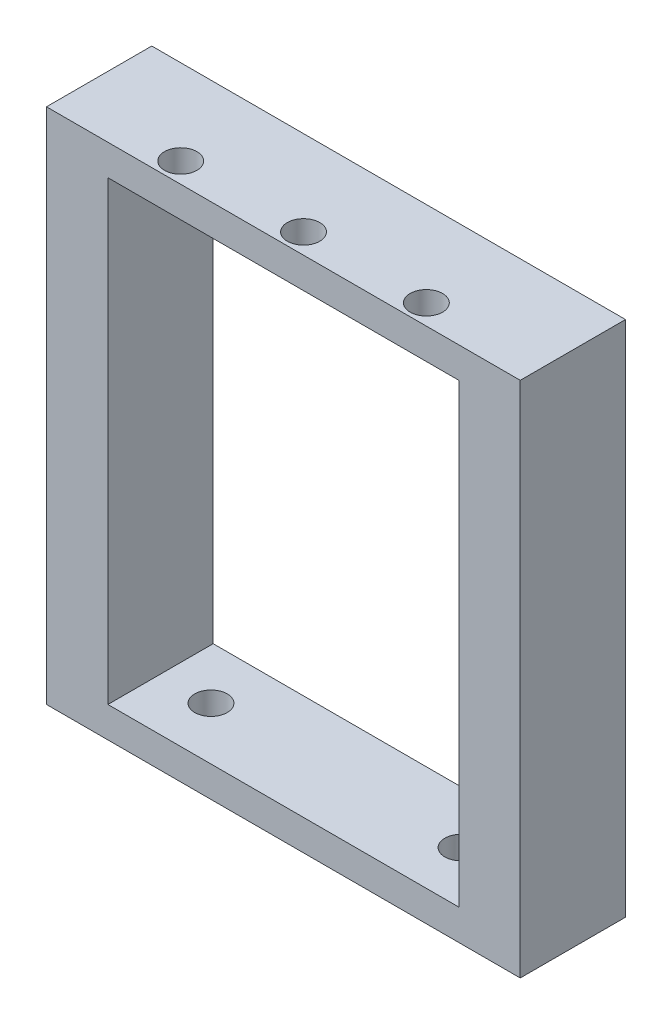
ISO-10303-21;
HEADER;
FILE_DESCRIPTION(('STEP AP214'),'2;1');
FILE_NAME('part.step','',(''),(''),'','','');
FILE_SCHEMA(('AUTOMOTIVE_DESIGN { 1 0 10303 214 1 1 1 1 }'));
ENDSEC;
DATA;
#1=APPLICATION_CONTEXT('core data for automotive mechanical design processes');
#2=APPLICATION_PROTOCOL_DEFINITION('international standard','automotive_design',2000,#1);
#3=PRODUCT_CONTEXT('',#1,'mechanical');
#4=PRODUCT('Part','Part','',(#3));
#5=PRODUCT_RELATED_PRODUCT_CATEGORY('part','',(#4));
#6=PRODUCT_DEFINITION_FORMATION('','',#4);
#7=PRODUCT_DEFINITION_CONTEXT('part definition',#1,'design');
#8=PRODUCT_DEFINITION('design','',#6,#7);
#9=PRODUCT_DEFINITION_SHAPE('','',#8);
#10=(LENGTH_UNIT() NAMED_UNIT(*) SI_UNIT(.MILLI.,.METRE.));
#11=(NAMED_UNIT(*) PLANE_ANGLE_UNIT() SI_UNIT($,.RADIAN.));
#12=(NAMED_UNIT(*) SI_UNIT($,.STERADIAN.) SOLID_ANGLE_UNIT());
#13=UNCERTAINTY_MEASURE_WITH_UNIT(LENGTH_MEASURE(1.E-05),#10,'distance_accuracy_value','');
#14=(GEOMETRIC_REPRESENTATION_CONTEXT(3) GLOBAL_UNCERTAINTY_ASSIGNED_CONTEXT((#13)) GLOBAL_UNIT_ASSIGNED_CONTEXT((#10,
#11,#12)) REPRESENTATION_CONTEXT('',''));
#15=CARTESIAN_POINT('',(0.,0.,0.));
#16=DIRECTION('',(0.,0.,1.));
#17=DIRECTION('',(1.,0.,0.));
#18=AXIS2_PLACEMENT_3D('',#15,#16,#17);
#19=CARTESIAN_POINT('',(0.,0.,12.));
#20=DIRECTION('',(0.,0.,-1.));
#21=DIRECTION('',(-1.,0.,0.));
#22=AXIS2_PLACEMENT_3D('',#19,#20,#21);
#23=PLANE('',#22);
#24=DIRECTION('',(0.,-1.,0.));
#25=VECTOR('',#24,1.);
#26=CARTESIAN_POINT('',(0.,0.,12.));
#27=LINE('',#26,#25);
#28=CARTESIAN_POINT('',(0.,59.,12.));
#29=VERTEX_POINT('',#28);
#30=CARTESIAN_POINT('',(0.,0.,12.));
#31=VERTEX_POINT('',#30);
#32=EDGE_CURVE('E157',#29,#31,#27,.T.);
#33=ORIENTED_EDGE('',*,*,#32,.T.);
#34=DIRECTION('',(1.,0.,0.));
#35=VECTOR('',#34,1.);
#36=CARTESIAN_POINT('',(0.,0.,12.));
#37=LINE('',#36,#35);
#38=CARTESIAN_POINT('',(54.,0.,12.));
#39=VERTEX_POINT('',#38);
#40=EDGE_CURVE('E161',#31,#39,#37,.T.);
#41=ORIENTED_EDGE('',*,*,#40,.T.);
#42=DIRECTION('',(0.,1.,0.));
#43=VECTOR('',#42,1.);
#44=CARTESIAN_POINT('',(54.,0.,12.));
#45=LINE('',#44,#43);
#46=CARTESIAN_POINT('',(54.,59.,12.));
#47=VERTEX_POINT('',#46);
#48=EDGE_CURVE('E165',#39,#47,#45,.T.);
#49=ORIENTED_EDGE('',*,*,#48,.T.);
#50=DIRECTION('',(-1.,0.,0.));
#51=VECTOR('',#50,1.);
#52=CARTESIAN_POINT('',(0.,59.,12.));
#53=LINE('',#52,#51);
#54=EDGE_CURVE('E168',#47,#29,#53,.T.);
#55=ORIENTED_EDGE('',*,*,#54,.T.);
#56=EDGE_LOOP('',(#33,#41,#49,#55));
#57=FACE_BOUND('',#56,.T.);
#58=DIRECTION('',(0.,1.,0.));
#59=VECTOR('',#58,1.);
#60=CARTESIAN_POINT('',(47.,3.50000000000001,12.));
#61=LINE('',#60,#59);
#62=CARTESIAN_POINT('',(47.,3.50000000000001,12.));
#63=VERTEX_POINT('',#62);
#64=CARTESIAN_POINT('',(47.,55.5,12.));
#65=VERTEX_POINT('',#64);
#66=EDGE_CURVE('E107',#63,#65,#61,.T.);
#67=ORIENTED_EDGE('',*,*,#66,.F.);
#68=DIRECTION('',(1.,0.,0.));
#69=VECTOR('',#68,1.);
#70=CARTESIAN_POINT('',(7.,3.50000000000001,12.));
#71=LINE('',#70,#69);
#72=CARTESIAN_POINT('',(7.,3.50000000000001,12.));
#73=VERTEX_POINT('',#72);
#74=EDGE_CURVE('E133',#73,#63,#71,.T.);
#75=ORIENTED_EDGE('',*,*,#74,.F.);
#76=DIRECTION('',(0.,-1.,0.));
#77=VECTOR('',#76,1.);
#78=CARTESIAN_POINT('',(7.,3.50000000000001,12.));
#79=LINE('',#78,#77);
#80=CARTESIAN_POINT('',(7.,55.5,12.));
#81=VERTEX_POINT('',#80);
#82=EDGE_CURVE('E129',#81,#73,#79,.T.);
#83=ORIENTED_EDGE('',*,*,#82,.F.);
#84=DIRECTION('',(-1.,0.,0.));
#85=VECTOR('',#84,1.);
#86=CARTESIAN_POINT('',(7.,55.5,12.));
#87=LINE('',#86,#85);
#88=EDGE_CURVE('E116',#65,#81,#87,.T.);
#89=ORIENTED_EDGE('',*,*,#88,.F.);
#90=EDGE_LOOP('',(#67,#75,#83,#89));
#91=FACE_BOUND('',#90,.T.);
#92=ADVANCED_FACE('F39',(#57,#91),#23,.F.);
#93=CARTESIAN_POINT('',(0.,0.,0.));
#94=DIRECTION('',(0.,0.,-1.));
#95=DIRECTION('',(-1.,0.,0.));
#96=AXIS2_PLACEMENT_3D('',#93,#94,#95);
#97=PLANE('',#96);
#98=DIRECTION('',(0.,-1.,0.));
#99=VECTOR('',#98,1.);
#100=CARTESIAN_POINT('',(0.,0.,0.));
#101=LINE('',#100,#99);
#102=CARTESIAN_POINT('',(0.,59.,0.));
#103=VERTEX_POINT('',#102);
#104=CARTESIAN_POINT('',(0.,0.,0.));
#105=VERTEX_POINT('',#104);
#106=EDGE_CURVE('E125',#103,#105,#101,.T.);
#107=ORIENTED_EDGE('',*,*,#106,.F.);
#108=DIRECTION('',(-1.,0.,0.));
#109=VECTOR('',#108,1.);
#110=CARTESIAN_POINT('',(0.,59.,0.));
#111=LINE('',#110,#109);
#112=CARTESIAN_POINT('',(54.,59.,0.));
#113=VERTEX_POINT('',#112);
#114=EDGE_CURVE('E162',#113,#103,#111,.T.);
#115=ORIENTED_EDGE('',*,*,#114,.F.);
#116=DIRECTION('',(0.,1.,0.));
#117=VECTOR('',#116,1.);
#118=CARTESIAN_POINT('',(54.,0.,0.));
#119=LINE('',#118,#117);
#120=CARTESIAN_POINT('',(54.,0.,0.));
#121=VERTEX_POINT('',#120);
#122=EDGE_CURVE('E178',#121,#113,#119,.T.);
#123=ORIENTED_EDGE('',*,*,#122,.F.);
#124=DIRECTION('',(1.,0.,0.));
#125=VECTOR('',#124,1.);
#126=CARTESIAN_POINT('',(0.,0.,0.));
#127=LINE('',#126,#125);
#128=EDGE_CURVE('E175',#105,#121,#127,.T.);
#129=ORIENTED_EDGE('',*,*,#128,.F.);
#130=EDGE_LOOP('',(#107,#115,#123,#129));
#131=FACE_BOUND('',#130,.T.);
#132=DIRECTION('',(1.,0.,0.));
#133=VECTOR('',#132,1.);
#134=CARTESIAN_POINT('',(7.,3.50000000000001,0.));
#135=LINE('',#134,#133);
#136=CARTESIAN_POINT('',(7.,3.50000000000001,0.));
#137=VERTEX_POINT('',#136);
#138=CARTESIAN_POINT('',(47.,3.50000000000001,0.));
#139=VERTEX_POINT('',#138);
#140=EDGE_CURVE('E117',#137,#139,#135,.T.);
#141=ORIENTED_EDGE('',*,*,#140,.T.);
#142=DIRECTION('',(0.,1.,0.));
#143=VECTOR('',#142,1.);
#144=CARTESIAN_POINT('',(47.,3.50000000000001,0.));
#145=LINE('',#144,#143);
#146=CARTESIAN_POINT('',(47.,55.5,0.));
#147=VERTEX_POINT('',#146);
#148=EDGE_CURVE('E65',#139,#147,#145,.T.);
#149=ORIENTED_EDGE('',*,*,#148,.T.);
#150=DIRECTION('',(-1.,0.,0.));
#151=VECTOR('',#150,1.);
#152=CARTESIAN_POINT('',(7.,55.5,0.));
#153=LINE('',#152,#151);
#154=CARTESIAN_POINT('',(7.,55.5,0.));
#155=VERTEX_POINT('',#154);
#156=EDGE_CURVE('E123',#147,#155,#153,.T.);
#157=ORIENTED_EDGE('',*,*,#156,.T.);
#158=DIRECTION('',(0.,-1.,0.));
#159=VECTOR('',#158,1.);
#160=CARTESIAN_POINT('',(7.,3.50000000000001,0.));
#161=LINE('',#160,#159);
#162=EDGE_CURVE('E144',#155,#137,#161,.T.);
#163=ORIENTED_EDGE('',*,*,#162,.T.);
#164=EDGE_LOOP('',(#141,#149,#157,#163));
#165=FACE_BOUND('',#164,.T.);
#166=ADVANCED_FACE('F251',(#131,#165),#97,.T.);
#167=CARTESIAN_POINT('',(0.,0.,12.));
#168=DIRECTION('',(1.,0.,0.));
#169=DIRECTION('',(0.,0.,-1.));
#170=AXIS2_PLACEMENT_3D('',#167,#168,#169);
#171=PLANE('',#170);
#172=ORIENTED_EDGE('',*,*,#106,.T.);
#173=DIRECTION('',(0.,0.,-1.));
#174=VECTOR('',#173,1.);
#175=CARTESIAN_POINT('',(0.,0.,12.));
#176=LINE('',#175,#174);
#177=EDGE_CURVE('E11',#31,#105,#176,.T.);
#178=ORIENTED_EDGE('',*,*,#177,.F.);
#179=ORIENTED_EDGE('',*,*,#32,.F.);
#180=DIRECTION('',(0.,0.,-1.));
#181=VECTOR('',#180,1.);
#182=CARTESIAN_POINT('',(0.,59.,12.));
#183=LINE('',#182,#181);
#184=EDGE_CURVE('E171',#29,#103,#183,.T.);
#185=ORIENTED_EDGE('',*,*,#184,.T.);
#186=EDGE_LOOP('',(#172,#178,#179,#185));
#187=FACE_BOUND('',#186,.T.);
#188=ADVANCED_FACE('F41',(#187),#171,.F.);
#189=CARTESIAN_POINT('',(0.,0.,12.));
#190=DIRECTION('',(0.,1.,0.));
#191=DIRECTION('',(0.,0.,1.));
#192=AXIS2_PLACEMENT_3D('',#189,#190,#191);
#193=PLANE('',#192);
#194=CARTESIAN_POINT('',(12.75,0.,6.));
#195=DIRECTION('',(0.,-1.,0.));
#196=DIRECTION('',(0.,0.,-1.));
#197=AXIS2_PLACEMENT_3D('',#194,#195,#196);
#198=CIRCLE('',#197,1.85);
#199=CARTESIAN_POINT('',(12.75,0.,4.15));
#200=VERTEX_POINT('',#199);
#201=EDGE_CURVE('E207',#200,#200,#198,.T.);
#202=ORIENTED_EDGE('',*,*,#201,.F.);
#203=EDGE_LOOP('',(#202));
#204=FACE_BOUND('',#203,.T.);
#205=CARTESIAN_POINT('',(41.25,0.,6.));
#206=DIRECTION('',(0.,-1.,0.));
#207=DIRECTION('',(0.,0.,1.));
#208=AXIS2_PLACEMENT_3D('',#205,#206,#207);
#209=CIRCLE('',#208,1.85);
#210=CARTESIAN_POINT('',(41.25,0.,7.85));
#211=VERTEX_POINT('',#210);
#212=EDGE_CURVE('E215',#211,#211,#209,.T.);
#213=ORIENTED_EDGE('',*,*,#212,.F.);
#214=EDGE_LOOP('',(#213));
#215=FACE_BOUND('',#214,.T.);
#216=ORIENTED_EDGE('',*,*,#128,.T.);
#217=DIRECTION('',(0.,0.,-1.));
#218=VECTOR('',#217,1.);
#219=CARTESIAN_POINT('',(54.,0.,12.));
#220=LINE('',#219,#218);
#221=EDGE_CURVE('E49',#39,#121,#220,.T.);
#222=ORIENTED_EDGE('',*,*,#221,.F.);
#223=ORIENTED_EDGE('',*,*,#40,.F.);
#224=ORIENTED_EDGE('',*,*,#177,.T.);
#225=EDGE_LOOP('',(#216,#222,#223,#224));
#226=FACE_BOUND('',#225,.T.);
#227=ADVANCED_FACE('F255',(#204,#215,#226),#193,.F.);
#228=CARTESIAN_POINT('',(54.,0.,12.));
#229=DIRECTION('',(-1.,0.,0.));
#230=DIRECTION('',(0.,0.,1.));
#231=AXIS2_PLACEMENT_3D('',#228,#229,#230);
#232=PLANE('',#231);
#233=ORIENTED_EDGE('',*,*,#122,.T.);
#234=DIRECTION('',(0.,0.,-1.));
#235=VECTOR('',#234,1.);
#236=CARTESIAN_POINT('',(54.,59.,12.));
#237=LINE('',#236,#235);
#238=EDGE_CURVE('E186',#47,#113,#237,.T.);
#239=ORIENTED_EDGE('',*,*,#238,.F.);
#240=ORIENTED_EDGE('',*,*,#48,.F.);
#241=ORIENTED_EDGE('',*,*,#221,.T.);
#242=EDGE_LOOP('',(#233,#239,#240,#241));
#243=FACE_BOUND('',#242,.T.);
#244=ADVANCED_FACE('F238',(#243),#232,.F.);
#245=CARTESIAN_POINT('',(0.,59.,12.));
#246=DIRECTION('',(0.,-1.,0.));
#247=DIRECTION('',(0.,0.,-1.));
#248=AXIS2_PLACEMENT_3D('',#245,#246,#247);
#249=PLANE('',#248);
#250=CARTESIAN_POINT('',(13.,59.,9.69999999999999));
#251=DIRECTION('',(0.,1.,0.));
#252=DIRECTION('',(-1.,0.,0.));
#253=AXIS2_PLACEMENT_3D('',#250,#251,#252);
#254=CIRCLE('',#253,1.85);
#255=CARTESIAN_POINT('',(11.15,59.,9.69999999999999));
#256=VERTEX_POINT('',#255);
#257=EDGE_CURVE('E198',#256,#256,#254,.T.);
#258=ORIENTED_EDGE('',*,*,#257,.F.);
#259=EDGE_LOOP('',(#258));
#260=FACE_BOUND('',#259,.T.);
#261=CARTESIAN_POINT('',(41.,59.0000000000002,9.69999999999999));
#262=DIRECTION('',(0.,1.,0.));
#263=DIRECTION('',(-1.,0.,0.));
#264=AXIS2_PLACEMENT_3D('',#261,#262,#263);
#265=CIRCLE('',#264,1.85);
#266=CARTESIAN_POINT('',(39.15,59.0000000000001,9.69999999999999));
#267=VERTEX_POINT('',#266);
#268=EDGE_CURVE('E226',#267,#267,#265,.T.);
#269=ORIENTED_EDGE('',*,*,#268,.F.);
#270=EDGE_LOOP('',(#269));
#271=FACE_BOUND('',#270,.T.);
#272=CARTESIAN_POINT('',(27.,59.0000000000001,9.69999999999999));
#273=DIRECTION('',(0.,1.,0.));
#274=DIRECTION('',(-1.,0.,0.));
#275=AXIS2_PLACEMENT_3D('',#272,#273,#274);
#276=CIRCLE('',#275,1.85);
#277=CARTESIAN_POINT('',(25.15,59.0000000000001,9.69999999999999));
#278=VERTEX_POINT('',#277);
#279=EDGE_CURVE('E213',#278,#278,#276,.T.);
#280=ORIENTED_EDGE('',*,*,#279,.F.);
#281=EDGE_LOOP('',(#280));
#282=FACE_BOUND('',#281,.T.);
#283=ORIENTED_EDGE('',*,*,#114,.T.);
#284=ORIENTED_EDGE('',*,*,#184,.F.);
#285=ORIENTED_EDGE('',*,*,#54,.F.);
#286=ORIENTED_EDGE('',*,*,#238,.T.);
#287=EDGE_LOOP('',(#283,#284,#285,#286));
#288=FACE_BOUND('',#287,.T.);
#289=ADVANCED_FACE('F235',(#260,#271,#282,#288),#249,.F.);
#290=CARTESIAN_POINT('',(47.,3.50000000000001,12.));
#291=DIRECTION('',(-1.,0.,0.));
#292=DIRECTION('',(0.,0.,1.));
#293=AXIS2_PLACEMENT_3D('',#290,#291,#292);
#294=PLANE('',#293);
#295=ORIENTED_EDGE('',*,*,#148,.F.);
#296=DIRECTION('',(0.,0.,-1.));
#297=VECTOR('',#296,1.);
#298=CARTESIAN_POINT('',(47.,3.50000000000001,12.));
#299=LINE('',#298,#297);
#300=EDGE_CURVE('E111',#63,#139,#299,.T.);
#301=ORIENTED_EDGE('',*,*,#300,.F.);
#302=ORIENTED_EDGE('',*,*,#66,.T.);
#303=DIRECTION('',(0.,0.,-1.));
#304=VECTOR('',#303,1.);
#305=CARTESIAN_POINT('',(47.,55.5,12.));
#306=LINE('',#305,#304);
#307=EDGE_CURVE('E110',#65,#147,#306,.T.);
#308=ORIENTED_EDGE('',*,*,#307,.T.);
#309=EDGE_LOOP('',(#295,#301,#302,#308));
#310=FACE_BOUND('',#309,.T.);
#311=ADVANCED_FACE('F109',(#310),#294,.T.);
#312=CARTESIAN_POINT('',(7.,55.5,12.));
#313=DIRECTION('',(0.,-1.,0.));
#314=DIRECTION('',(0.,0.,-1.));
#315=AXIS2_PLACEMENT_3D('',#312,#313,#314);
#316=PLANE('',#315);
#317=CARTESIAN_POINT('',(13.,55.5,9.69999999999999));
#318=DIRECTION('',(0.,-1.,0.));
#319=DIRECTION('',(0.,0.,-1.));
#320=AXIS2_PLACEMENT_3D('',#317,#318,#319);
#321=CIRCLE('',#320,1.85);
#322=CARTESIAN_POINT('',(13.,55.5,7.84999999999999));
#323=VERTEX_POINT('',#322);
#324=EDGE_CURVE('E141',#323,#323,#321,.T.);
#325=ORIENTED_EDGE('',*,*,#324,.F.);
#326=EDGE_LOOP('',(#325));
#327=FACE_BOUND('',#326,.T.);
#328=CARTESIAN_POINT('',(41.,55.5,9.69999999999999));
#329=DIRECTION('',(0.,-1.,0.));
#330=DIRECTION('',(0.,0.,-1.));
#331=AXIS2_PLACEMENT_3D('',#328,#329,#330);
#332=CIRCLE('',#331,1.85);
#333=CARTESIAN_POINT('',(41.,55.5,7.84999999999999));
#334=VERTEX_POINT('',#333);
#335=EDGE_CURVE('E197',#334,#334,#332,.T.);
#336=ORIENTED_EDGE('',*,*,#335,.F.);
#337=EDGE_LOOP('',(#336));
#338=FACE_BOUND('',#337,.T.);
#339=CARTESIAN_POINT('',(27.,55.5,9.69999999999999));
#340=DIRECTION('',(0.,-1.,0.));
#341=DIRECTION('',(0.,0.,-1.));
#342=AXIS2_PLACEMENT_3D('',#339,#340,#341);
#343=CIRCLE('',#342,1.85);
#344=CARTESIAN_POINT('',(27.,55.5,7.84999999999999));
#345=VERTEX_POINT('',#344);
#346=EDGE_CURVE('E193',#345,#345,#343,.T.);
#347=ORIENTED_EDGE('',*,*,#346,.F.);
#348=EDGE_LOOP('',(#347));
#349=FACE_BOUND('',#348,.T.);
#350=ORIENTED_EDGE('',*,*,#156,.F.);
#351=ORIENTED_EDGE('',*,*,#307,.F.);
#352=ORIENTED_EDGE('',*,*,#88,.T.);
#353=DIRECTION('',(0.,0.,-1.));
#354=VECTOR('',#353,1.);
#355=CARTESIAN_POINT('',(7.,55.5,12.));
#356=LINE('',#355,#354);
#357=EDGE_CURVE('E126',#81,#155,#356,.T.);
#358=ORIENTED_EDGE('',*,*,#357,.T.);
#359=EDGE_LOOP('',(#350,#351,#352,#358));
#360=FACE_BOUND('',#359,.T.);
#361=ADVANCED_FACE('F120',(#327,#338,#349,#360),#316,.T.);
#362=CARTESIAN_POINT('',(7.,3.50000000000001,12.));
#363=DIRECTION('',(1.,0.,0.));
#364=DIRECTION('',(0.,0.,-1.));
#365=AXIS2_PLACEMENT_3D('',#362,#363,#364);
#366=PLANE('',#365);
#367=ORIENTED_EDGE('',*,*,#162,.F.);
#368=ORIENTED_EDGE('',*,*,#357,.F.);
#369=ORIENTED_EDGE('',*,*,#82,.T.);
#370=DIRECTION('',(0.,0.,-1.));
#371=VECTOR('',#370,1.);
#372=CARTESIAN_POINT('',(7.,3.50000000000001,12.));
#373=LINE('',#372,#371);
#374=EDGE_CURVE('E57',#73,#137,#373,.T.);
#375=ORIENTED_EDGE('',*,*,#374,.T.);
#376=EDGE_LOOP('',(#367,#368,#369,#375));
#377=FACE_BOUND('',#376,.T.);
#378=ADVANCED_FACE('F276',(#377),#366,.T.);
#379=CARTESIAN_POINT('',(7.,3.50000000000001,12.));
#380=DIRECTION('',(0.,1.,0.));
#381=DIRECTION('',(0.,0.,1.));
#382=AXIS2_PLACEMENT_3D('',#379,#380,#381);
#383=PLANE('',#382);
#384=CARTESIAN_POINT('',(12.75,3.5,6.));
#385=DIRECTION('',(0.,1.,0.));
#386=DIRECTION('',(0.,0.,1.));
#387=AXIS2_PLACEMENT_3D('',#384,#385,#386);
#388=CIRCLE('',#387,1.85);
#389=CARTESIAN_POINT('',(12.75,3.5,7.85));
#390=VERTEX_POINT('',#389);
#391=EDGE_CURVE('E43',#390,#390,#388,.T.);
#392=ORIENTED_EDGE('',*,*,#391,.F.);
#393=EDGE_LOOP('',(#392));
#394=FACE_BOUND('',#393,.T.);
#395=CARTESIAN_POINT('',(41.25,3.5,6.));
#396=DIRECTION('',(0.,1.,0.));
#397=DIRECTION('',(0.,0.,1.));
#398=AXIS2_PLACEMENT_3D('',#395,#396,#397);
#399=CIRCLE('',#398,1.85);
#400=CARTESIAN_POINT('',(41.25,3.5,7.85));
#401=VERTEX_POINT('',#400);
#402=EDGE_CURVE('E204',#401,#401,#399,.T.);
#403=ORIENTED_EDGE('',*,*,#402,.F.);
#404=EDGE_LOOP('',(#403));
#405=FACE_BOUND('',#404,.T.);
#406=ORIENTED_EDGE('',*,*,#140,.F.);
#407=ORIENTED_EDGE('',*,*,#374,.F.);
#408=ORIENTED_EDGE('',*,*,#74,.T.);
#409=ORIENTED_EDGE('',*,*,#300,.T.);
#410=EDGE_LOOP('',(#406,#407,#408,#409));
#411=FACE_BOUND('',#410,.T.);
#412=ADVANCED_FACE('F280',(#394,#405,#411),#383,.T.);
#413=CARTESIAN_POINT('',(27.,49.0000000000001,9.69999999999999));
#414=DIRECTION('',(0.,1.,0.));
#415=DIRECTION('',(-1.,0.,0.));
#416=AXIS2_PLACEMENT_3D('',#413,#414,#415);
#417=CYLINDRICAL_SURFACE('',#416,1.85);
#418=ORIENTED_EDGE('',*,*,#346,.T.);
#419=EDGE_LOOP('',(#418));
#420=FACE_BOUND('',#419,.T.);
#421=ORIENTED_EDGE('',*,*,#279,.T.);
#422=EDGE_LOOP('',(#421));
#423=FACE_BOUND('',#422,.T.);
#424=ADVANCED_FACE('F233',(#420,#423),#417,.F.);
#425=CARTESIAN_POINT('',(41.,49.0000000000002,9.69999999999999));
#426=DIRECTION('',(0.,1.,0.));
#427=DIRECTION('',(-1.,0.,0.));
#428=AXIS2_PLACEMENT_3D('',#425,#426,#427);
#429=CYLINDRICAL_SURFACE('',#428,1.85);
#430=ORIENTED_EDGE('',*,*,#335,.T.);
#431=EDGE_LOOP('',(#430));
#432=FACE_BOUND('',#431,.T.);
#433=ORIENTED_EDGE('',*,*,#268,.T.);
#434=EDGE_LOOP('',(#433));
#435=FACE_BOUND('',#434,.T.);
#436=ADVANCED_FACE('F287',(#432,#435),#429,.F.);
#437=CARTESIAN_POINT('',(13.,49.,9.69999999999999));
#438=DIRECTION('',(0.,1.,0.));
#439=DIRECTION('',(-1.,0.,0.));
#440=AXIS2_PLACEMENT_3D('',#437,#438,#439);
#441=CYLINDRICAL_SURFACE('',#440,1.85);
#442=ORIENTED_EDGE('',*,*,#324,.T.);
#443=EDGE_LOOP('',(#442));
#444=FACE_BOUND('',#443,.T.);
#445=ORIENTED_EDGE('',*,*,#257,.T.);
#446=EDGE_LOOP('',(#445));
#447=FACE_BOUND('',#446,.T.);
#448=ADVANCED_FACE('F291',(#444,#447),#441,.F.);
#449=CARTESIAN_POINT('',(41.25,10.,6.));
#450=DIRECTION('',(0.,-1.,0.));
#451=DIRECTION('',(0.,0.,-1.));
#452=AXIS2_PLACEMENT_3D('',#449,#450,#451);
#453=CYLINDRICAL_SURFACE('',#452,1.85);
#454=ORIENTED_EDGE('',*,*,#402,.T.);
#455=EDGE_LOOP('',(#454));
#456=FACE_BOUND('',#455,.T.);
#457=ORIENTED_EDGE('',*,*,#212,.T.);
#458=EDGE_LOOP('',(#457));
#459=FACE_BOUND('',#458,.T.);
#460=ADVANCED_FACE('F295',(#456,#459),#453,.F.);
#461=CARTESIAN_POINT('',(12.75,10.,6.));
#462=DIRECTION('',(0.,-1.,0.));
#463=DIRECTION('',(0.,0.,-1.));
#464=AXIS2_PLACEMENT_3D('',#461,#462,#463);
#465=CYLINDRICAL_SURFACE('',#464,1.85);
#466=ORIENTED_EDGE('',*,*,#391,.T.);
#467=EDGE_LOOP('',(#466));
#468=FACE_BOUND('',#467,.T.);
#469=ORIENTED_EDGE('',*,*,#201,.T.);
#470=EDGE_LOOP('',(#469));
#471=FACE_BOUND('',#470,.T.);
#472=ADVANCED_FACE('F299',(#468,#471),#465,.F.);
#473=CLOSED_SHELL('',(#92,#166,#188,#227,#244,#289,#311,#361,#378,#412,#424,#436,#448,#460,#472));
#474=MANIFOLD_SOLID_BREP('B2',#473);
#475=ADVANCED_BREP_SHAPE_REPRESENTATION('',(#18,#474),#14);
#476=SHAPE_DEFINITION_REPRESENTATION(#9,#475);
ENDSEC;
END-ISO-10303-21;
